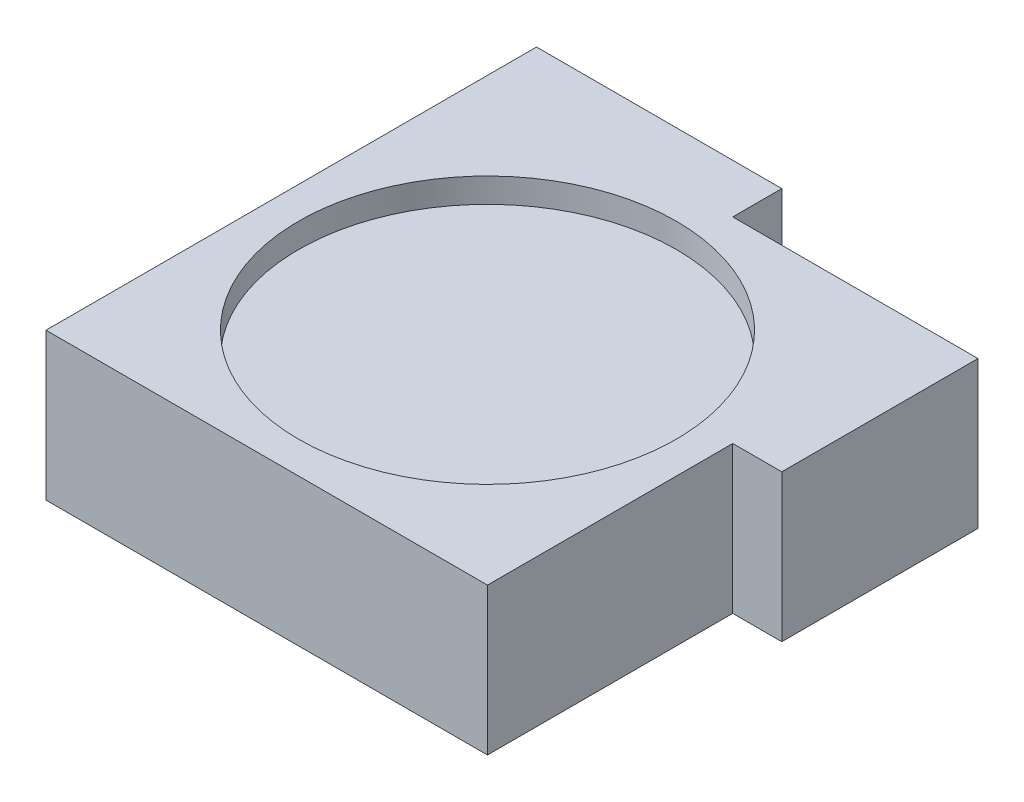
ISO-10303-21;
HEADER;
FILE_DESCRIPTION(('STEP AP214'),'2;1');
FILE_NAME('part.step','',(''),(''),'','','');
FILE_SCHEMA(('AUTOMOTIVE_DESIGN { 1 0 10303 214 1 1 1 1 }'));
ENDSEC;
DATA;
#1=APPLICATION_CONTEXT('core data for automotive mechanical design processes');
#2=APPLICATION_PROTOCOL_DEFINITION('international standard','automotive_design',2000,#1);
#3=PRODUCT_CONTEXT('',#1,'mechanical');
#4=PRODUCT('Part','Part','',(#3));
#5=PRODUCT_RELATED_PRODUCT_CATEGORY('part','',(#4));
#6=PRODUCT_DEFINITION_FORMATION('','',#4);
#7=PRODUCT_DEFINITION_CONTEXT('part definition',#1,'design');
#8=PRODUCT_DEFINITION('design','',#6,#7);
#9=PRODUCT_DEFINITION_SHAPE('','',#8);
#10=(LENGTH_UNIT() NAMED_UNIT(*) SI_UNIT(.MILLI.,.METRE.));
#11=(NAMED_UNIT(*) PLANE_ANGLE_UNIT() SI_UNIT($,.RADIAN.));
#12=(NAMED_UNIT(*) SI_UNIT($,.STERADIAN.) SOLID_ANGLE_UNIT());
#13=UNCERTAINTY_MEASURE_WITH_UNIT(LENGTH_MEASURE(1.E-05),#10,'distance_accuracy_value','');
#14=(GEOMETRIC_REPRESENTATION_CONTEXT(3) GLOBAL_UNCERTAINTY_ASSIGNED_CONTEXT((#13)) GLOBAL_UNIT_ASSIGNED_CONTEXT((#10,
#11,#12)) REPRESENTATION_CONTEXT('',''));
#15=CARTESIAN_POINT('',(0.,0.,0.));
#16=DIRECTION('',(0.,0.,1.));
#17=DIRECTION('',(1.,0.,0.));
#18=AXIS2_PLACEMENT_3D('',#15,#16,#17);
#19=CARTESIAN_POINT('',(0.,30.,0.));
#20=DIRECTION('',(0.,0.,-1.));
#21=DIRECTION('',(-1.,0.,0.));
#22=AXIS2_PLACEMENT_3D('',#19,#20,#21);
#23=PLANE('',#22);
#24=DIRECTION('',(1.,0.,0.));
#25=VECTOR('',#24,1.);
#26=CARTESIAN_POINT('',(0.,0.,0.));
#27=LINE('',#26,#25);
#28=CARTESIAN_POINT('',(0.,0.,0.));
#29=VERTEX_POINT('',#28);
#30=CARTESIAN_POINT('',(90.,0.,0.));
#31=VERTEX_POINT('',#30);
#32=EDGE_CURVE('E145',#29,#31,#27,.T.);
#33=ORIENTED_EDGE('',*,*,#32,.T.);
#34=DIRECTION('',(0.,-1.,0.));
#35=VECTOR('',#34,1.);
#36=CARTESIAN_POINT('',(90.,30.,0.));
#37=LINE('',#36,#35);
#38=CARTESIAN_POINT('',(90.,30.,0.));
#39=VERTEX_POINT('',#38);
#40=EDGE_CURVE('E11',#39,#31,#37,.T.);
#41=ORIENTED_EDGE('',*,*,#40,.F.);
#42=DIRECTION('',(1.,0.,0.));
#43=VECTOR('',#42,1.);
#44=CARTESIAN_POINT('',(0.,30.,0.));
#45=LINE('',#44,#43);
#46=CARTESIAN_POINT('',(0.,30.,0.));
#47=VERTEX_POINT('',#46);
#48=EDGE_CURVE('E174',#47,#39,#45,.T.);
#49=ORIENTED_EDGE('',*,*,#48,.F.);
#50=DIRECTION('',(0.,-1.,0.));
#51=VECTOR('',#50,1.);
#52=CARTESIAN_POINT('',(0.,30.,0.));
#53=LINE('',#52,#51);
#54=EDGE_CURVE('E60',#47,#29,#53,.T.);
#55=ORIENTED_EDGE('',*,*,#54,.T.);
#56=EDGE_LOOP('',(#33,#41,#49,#55));
#57=FACE_BOUND('',#56,.T.);
#58=ADVANCED_FACE('F43',(#57),#23,.F.);
#59=CARTESIAN_POINT('',(90.,30.,0.));
#60=DIRECTION('',(-1.,0.,0.));
#61=DIRECTION('',(0.,0.,1.));
#62=AXIS2_PLACEMENT_3D('',#59,#60,#61);
#63=PLANE('',#62);
#64=DIRECTION('',(0.,0.,-1.));
#65=VECTOR('',#64,1.);
#66=CARTESIAN_POINT('',(90.,0.,0.));
#67=LINE('',#66,#65);
#68=CARTESIAN_POINT('',(90.,0.,-50.));
#69=VERTEX_POINT('',#68);
#70=EDGE_CURVE('E148',#31,#69,#67,.T.);
#71=ORIENTED_EDGE('',*,*,#70,.T.);
#72=DIRECTION('',(0.,-1.,0.));
#73=VECTOR('',#72,1.);
#74=CARTESIAN_POINT('',(90.,30.,-50.));
#75=LINE('',#74,#73);
#76=CARTESIAN_POINT('',(90.,30.,-50.));
#77=VERTEX_POINT('',#76);
#78=EDGE_CURVE('E52',#77,#69,#75,.T.);
#79=ORIENTED_EDGE('',*,*,#78,.F.);
#80=DIRECTION('',(0.,0.,-1.));
#81=VECTOR('',#80,1.);
#82=CARTESIAN_POINT('',(90.,30.,0.));
#83=LINE('',#82,#81);
#84=EDGE_CURVE('E98',#39,#77,#83,.T.);
#85=ORIENTED_EDGE('',*,*,#84,.F.);
#86=ORIENTED_EDGE('',*,*,#40,.T.);
#87=EDGE_LOOP('',(#71,#79,#85,#86));
#88=FACE_BOUND('',#87,.T.);
#89=ADVANCED_FACE('F193',(#88),#63,.F.);
#90=CARTESIAN_POINT('',(100.,30.,-50.));
#91=DIRECTION('',(0.,0.,1.));
#92=DIRECTION('',(1.,0.,0.));
#93=AXIS2_PLACEMENT_3D('',#90,#91,#92);
#94=PLANE('',#93);
#95=DIRECTION('',(-1.,0.,0.));
#96=VECTOR('',#95,1.);
#97=CARTESIAN_POINT('',(100.,0.,-50.));
#98=LINE('',#97,#96);
#99=CARTESIAN_POINT('',(100.,0.,-50.));
#100=VERTEX_POINT('',#99);
#101=EDGE_CURVE('E153',#100,#69,#98,.T.);
#102=ORIENTED_EDGE('',*,*,#101,.F.);
#103=DIRECTION('',(0.,-1.,0.));
#104=VECTOR('',#103,1.);
#105=CARTESIAN_POINT('',(100.,30.,-50.));
#106=LINE('',#105,#104);
#107=CARTESIAN_POINT('',(100.,30.,-50.));
#108=VERTEX_POINT('',#107);
#109=EDGE_CURVE('E184',#108,#100,#106,.T.);
#110=ORIENTED_EDGE('',*,*,#109,.F.);
#111=DIRECTION('',(-1.,0.,0.));
#112=VECTOR('',#111,1.);
#113=CARTESIAN_POINT('',(100.,30.,-50.));
#114=LINE('',#113,#112);
#115=EDGE_CURVE('E192',#108,#77,#114,.T.);
#116=ORIENTED_EDGE('',*,*,#115,.T.);
#117=ORIENTED_EDGE('',*,*,#78,.T.);
#118=EDGE_LOOP('',(#102,#110,#116,#117));
#119=FACE_BOUND('',#118,.T.);
#120=ADVANCED_FACE('F190',(#119),#94,.T.);
#121=CARTESIAN_POINT('',(100.,30.,-90.));
#122=DIRECTION('',(1.,0.,0.));
#123=DIRECTION('',(0.,0.,-1.));
#124=AXIS2_PLACEMENT_3D('',#121,#122,#123);
#125=PLANE('',#124);
#126=DIRECTION('',(0.,0.,1.));
#127=VECTOR('',#126,1.);
#128=CARTESIAN_POINT('',(100.,0.,-90.));
#129=LINE('',#128,#127);
#130=CARTESIAN_POINT('',(100.,0.,-90.));
#131=VERTEX_POINT('',#130);
#132=EDGE_CURVE('E157',#131,#100,#129,.T.);
#133=ORIENTED_EDGE('',*,*,#132,.F.);
#134=DIRECTION('',(0.,-1.,0.));
#135=VECTOR('',#134,1.);
#136=CARTESIAN_POINT('',(100.,30.,-90.));
#137=LINE('',#136,#135);
#138=CARTESIAN_POINT('',(100.,30.,-90.));
#139=VERTEX_POINT('',#138);
#140=EDGE_CURVE('E181',#139,#131,#137,.T.);
#141=ORIENTED_EDGE('',*,*,#140,.F.);
#142=DIRECTION('',(0.,0.,1.));
#143=VECTOR('',#142,1.);
#144=CARTESIAN_POINT('',(100.,30.,-90.));
#145=LINE('',#144,#143);
#146=EDGE_CURVE('E202',#139,#108,#145,.T.);
#147=ORIENTED_EDGE('',*,*,#146,.T.);
#148=ORIENTED_EDGE('',*,*,#109,.T.);
#149=EDGE_LOOP('',(#133,#141,#147,#148));
#150=FACE_BOUND('',#149,.T.);
#151=ADVANCED_FACE('F200',(#150),#125,.T.);
#152=CARTESIAN_POINT('',(50.,30.,-90.));
#153=DIRECTION('',(0.,0.,-1.));
#154=DIRECTION('',(-1.,0.,0.));
#155=AXIS2_PLACEMENT_3D('',#152,#153,#154);
#156=PLANE('',#155);
#157=DIRECTION('',(1.,0.,0.));
#158=VECTOR('',#157,1.);
#159=CARTESIAN_POINT('',(50.,0.,-90.));
#160=LINE('',#159,#158);
#161=CARTESIAN_POINT('',(50.,0.,-90.));
#162=VERTEX_POINT('',#161);
#163=EDGE_CURVE('E161',#162,#131,#160,.T.);
#164=ORIENTED_EDGE('',*,*,#163,.F.);
#165=DIRECTION('',(0.,-1.,0.));
#166=VECTOR('',#165,1.);
#167=CARTESIAN_POINT('',(50.,30.,-90.));
#168=LINE('',#167,#166);
#169=CARTESIAN_POINT('',(50.,30.,-90.));
#170=VERTEX_POINT('',#169);
#171=EDGE_CURVE('E124',#170,#162,#168,.T.);
#172=ORIENTED_EDGE('',*,*,#171,.F.);
#173=DIRECTION('',(1.,0.,0.));
#174=VECTOR('',#173,1.);
#175=CARTESIAN_POINT('',(50.,30.,-90.));
#176=LINE('',#175,#174);
#177=EDGE_CURVE('E134',#170,#139,#176,.T.);
#178=ORIENTED_EDGE('',*,*,#177,.T.);
#179=ORIENTED_EDGE('',*,*,#140,.T.);
#180=EDGE_LOOP('',(#164,#172,#178,#179));
#181=FACE_BOUND('',#180,.T.);
#182=ADVANCED_FACE('F212',(#181),#156,.T.);
#183=CARTESIAN_POINT('',(50.,30.,-100.));
#184=DIRECTION('',(1.,0.,0.));
#185=DIRECTION('',(0.,0.,-1.));
#186=AXIS2_PLACEMENT_3D('',#183,#184,#185);
#187=PLANE('',#186);
#188=DIRECTION('',(0.,0.,1.));
#189=VECTOR('',#188,1.);
#190=CARTESIAN_POINT('',(50.,0.,-100.));
#191=LINE('',#190,#189);
#192=CARTESIAN_POINT('',(50.,0.,-100.));
#193=VERTEX_POINT('',#192);
#194=EDGE_CURVE('E119',#193,#162,#191,.T.);
#195=ORIENTED_EDGE('',*,*,#194,.F.);
#196=DIRECTION('',(0.,-1.,0.));
#197=VECTOR('',#196,1.);
#198=CARTESIAN_POINT('',(50.,30.,-100.));
#199=LINE('',#198,#197);
#200=CARTESIAN_POINT('',(50.,30.,-100.));
#201=VERTEX_POINT('',#200);
#202=EDGE_CURVE('E114',#201,#193,#199,.T.);
#203=ORIENTED_EDGE('',*,*,#202,.F.);
#204=DIRECTION('',(0.,0.,1.));
#205=VECTOR('',#204,1.);
#206=CARTESIAN_POINT('',(50.,30.,-100.));
#207=LINE('',#206,#205);
#208=EDGE_CURVE('E117',#201,#170,#207,.T.);
#209=ORIENTED_EDGE('',*,*,#208,.T.);
#210=ORIENTED_EDGE('',*,*,#171,.T.);
#211=EDGE_LOOP('',(#195,#203,#209,#210));
#212=FACE_BOUND('',#211,.T.);
#213=ADVANCED_FACE('F116',(#212),#187,.T.);
#214=CARTESIAN_POINT('',(0.,30.,-100.));
#215=DIRECTION('',(0.,0.,-1.));
#216=DIRECTION('',(-1.,0.,0.));
#217=AXIS2_PLACEMENT_3D('',#214,#215,#216);
#218=PLANE('',#217);
#219=DIRECTION('',(1.,0.,0.));
#220=VECTOR('',#219,1.);
#221=CARTESIAN_POINT('',(0.,0.,-100.));
#222=LINE('',#221,#220);
#223=CARTESIAN_POINT('',(0.,0.,-100.));
#224=VERTEX_POINT('',#223);
#225=EDGE_CURVE('E167',#224,#193,#222,.T.);
#226=ORIENTED_EDGE('',*,*,#225,.F.);
#227=DIRECTION('',(0.,-1.,0.));
#228=VECTOR('',#227,1.);
#229=CARTESIAN_POINT('',(0.,30.,-100.));
#230=LINE('',#229,#228);
#231=CARTESIAN_POINT('',(0.,30.,-100.));
#232=VERTEX_POINT('',#231);
#233=EDGE_CURVE('E86',#232,#224,#230,.T.);
#234=ORIENTED_EDGE('',*,*,#233,.F.);
#235=DIRECTION('',(1.,0.,0.));
#236=VECTOR('',#235,1.);
#237=CARTESIAN_POINT('',(0.,30.,-100.));
#238=LINE('',#237,#236);
#239=EDGE_CURVE('E131',#232,#201,#238,.T.);
#240=ORIENTED_EDGE('',*,*,#239,.T.);
#241=ORIENTED_EDGE('',*,*,#202,.T.);
#242=EDGE_LOOP('',(#226,#234,#240,#241));
#243=FACE_BOUND('',#242,.T.);
#244=ADVANCED_FACE('F137',(#243),#218,.T.);
#245=CARTESIAN_POINT('',(0.,30.,0.));
#246=DIRECTION('',(-1.,0.,0.));
#247=DIRECTION('',(0.,0.,1.));
#248=AXIS2_PLACEMENT_3D('',#245,#246,#247);
#249=PLANE('',#248);
#250=DIRECTION('',(0.,0.,-1.));
#251=VECTOR('',#250,1.);
#252=CARTESIAN_POINT('',(0.,0.,0.));
#253=LINE('',#252,#251);
#254=EDGE_CURVE('E170',#29,#224,#253,.T.);
#255=ORIENTED_EDGE('',*,*,#254,.F.);
#256=ORIENTED_EDGE('',*,*,#54,.F.);
#257=DIRECTION('',(0.,0.,-1.));
#258=VECTOR('',#257,1.);
#259=CARTESIAN_POINT('',(0.,30.,0.));
#260=LINE('',#259,#258);
#261=EDGE_CURVE('E139',#47,#232,#260,.T.);
#262=ORIENTED_EDGE('',*,*,#261,.T.);
#263=ORIENTED_EDGE('',*,*,#233,.T.);
#264=EDGE_LOOP('',(#255,#256,#262,#263));
#265=FACE_BOUND('',#264,.T.);
#266=ADVANCED_FACE('F213',(#265),#249,.T.);
#267=CARTESIAN_POINT('',(0.,30.,0.));
#268=DIRECTION('',(0.,1.,0.));
#269=DIRECTION('',(0.,0.,1.));
#270=AXIS2_PLACEMENT_3D('',#267,#268,#269);
#271=PLANE('',#270);
#272=CARTESIAN_POINT('',(45.,30.,-45.));
#273=DIRECTION('',(0.,1.,0.));
#274=DIRECTION('',(0.,0.,1.));
#275=AXIS2_PLACEMENT_3D('',#272,#273,#274);
#276=CIRCLE('',#275,38.5);
#277=CARTESIAN_POINT('',(45.,30.,-6.50000000000001));
#278=VERTEX_POINT('',#277);
#279=EDGE_CURVE('E230',#278,#278,#276,.T.);
#280=ORIENTED_EDGE('',*,*,#279,.F.);
#281=EDGE_LOOP('',(#280));
#282=FACE_BOUND('',#281,.T.);
#283=ORIENTED_EDGE('',*,*,#48,.T.);
#284=ORIENTED_EDGE('',*,*,#84,.T.);
#285=ORIENTED_EDGE('',*,*,#115,.F.);
#286=ORIENTED_EDGE('',*,*,#146,.F.);
#287=ORIENTED_EDGE('',*,*,#177,.F.);
#288=ORIENTED_EDGE('',*,*,#208,.F.);
#289=ORIENTED_EDGE('',*,*,#239,.F.);
#290=ORIENTED_EDGE('',*,*,#261,.F.);
#291=EDGE_LOOP('',(#283,#284,#285,#286,#287,#288,#289,#290));
#292=FACE_BOUND('',#291,.T.);
#293=ADVANCED_FACE('F129',(#282,#292),#271,.T.);
#294=CARTESIAN_POINT('',(0.,0.,0.));
#295=DIRECTION('',(0.,1.,0.));
#296=DIRECTION('',(0.,0.,1.));
#297=AXIS2_PLACEMENT_3D('',#294,#295,#296);
#298=PLANE('',#297);
#299=ORIENTED_EDGE('',*,*,#32,.F.);
#300=ORIENTED_EDGE('',*,*,#254,.T.);
#301=ORIENTED_EDGE('',*,*,#225,.T.);
#302=ORIENTED_EDGE('',*,*,#194,.T.);
#303=ORIENTED_EDGE('',*,*,#163,.T.);
#304=ORIENTED_EDGE('',*,*,#132,.T.);
#305=ORIENTED_EDGE('',*,*,#101,.T.);
#306=ORIENTED_EDGE('',*,*,#70,.F.);
#307=EDGE_LOOP('',(#299,#300,#301,#302,#303,#304,#305,#306));
#308=FACE_BOUND('',#307,.T.);
#309=ADVANCED_FACE('F196',(#308),#298,.F.);
#310=CARTESIAN_POINT('',(45.,25.,-45.));
#311=DIRECTION('',(0.,1.,0.));
#312=DIRECTION('',(0.,0.,1.));
#313=AXIS2_PLACEMENT_3D('',#310,#311,#312);
#314=CYLINDRICAL_SURFACE('',#313,38.5);
#315=CARTESIAN_POINT('',(45.,25.,-45.));
#316=DIRECTION('',(0.,1.,0.));
#317=DIRECTION('',(0.,0.,1.));
#318=AXIS2_PLACEMENT_3D('',#315,#316,#317);
#319=CIRCLE('',#318,38.5);
#320=CARTESIAN_POINT('',(45.,25.,-6.50000000000001));
#321=VERTEX_POINT('',#320);
#322=EDGE_CURVE('E149',#321,#321,#319,.T.);
#323=ORIENTED_EDGE('',*,*,#322,.F.);
#324=EDGE_LOOP('',(#323));
#325=FACE_BOUND('',#324,.T.);
#326=ORIENTED_EDGE('',*,*,#279,.T.);
#327=EDGE_LOOP('',(#326));
#328=FACE_BOUND('',#327,.T.);
#329=ADVANCED_FACE('F240',(#325,#328),#314,.F.);
#330=CARTESIAN_POINT('',(45.,25.,-45.));
#331=DIRECTION('',(0.,1.,0.));
#332=DIRECTION('',(0.,0.,1.));
#333=AXIS2_PLACEMENT_3D('',#330,#331,#332);
#334=PLANE('',#333);
#335=ORIENTED_EDGE('',*,*,#322,.T.);
#336=EDGE_LOOP('',(#335));
#337=FACE_BOUND('',#336,.T.);
#338=ADVANCED_FACE('F238',(#337),#334,.T.);
#339=CLOSED_SHELL('',(#58,#89,#120,#151,#182,#213,#244,#266,#293,#309,#329,#338));
#340=MANIFOLD_SOLID_BREP('B2',#339);
#341=ADVANCED_BREP_SHAPE_REPRESENTATION('',(#18,#340),#14);
#342=SHAPE_DEFINITION_REPRESENTATION(#9,#341);
ENDSEC;
END-ISO-10303-21;
